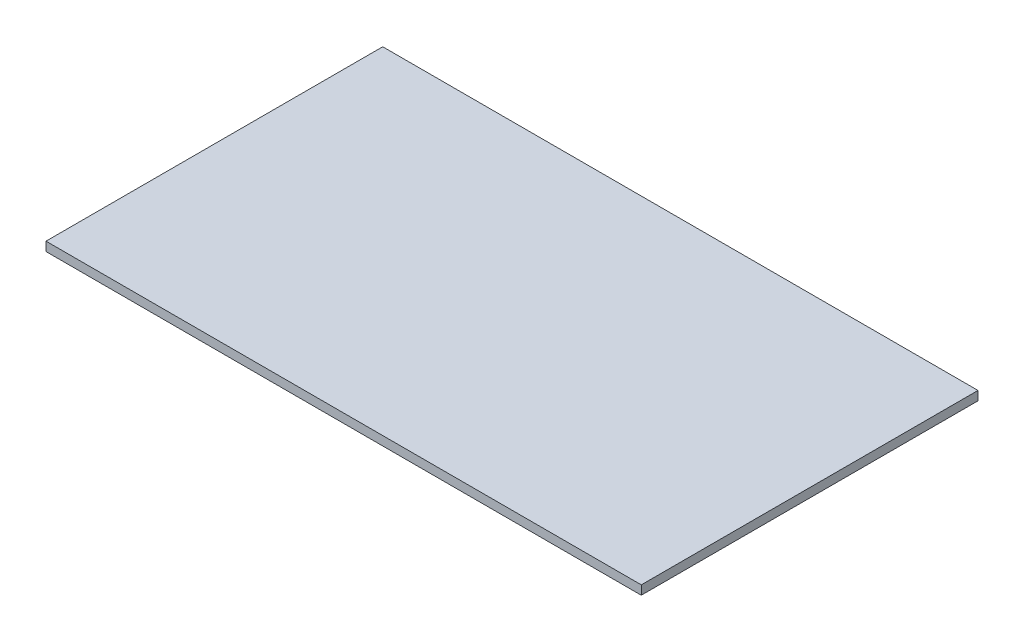
ISO-10303-21;
HEADER;
FILE_DESCRIPTION(('STEP AP214'),'2;1');
FILE_NAME('part.step','',(''),(''),'','','');
FILE_SCHEMA(('AUTOMOTIVE_DESIGN { 1 0 10303 214 1 1 1 1 }'));
ENDSEC;
DATA;
#1=APPLICATION_CONTEXT('core data for automotive mechanical design processes');
#2=APPLICATION_PROTOCOL_DEFINITION('international standard','automotive_design',2000,#1);
#3=PRODUCT_CONTEXT('',#1,'mechanical');
#4=PRODUCT('Part','Part','',(#3));
#5=PRODUCT_RELATED_PRODUCT_CATEGORY('part','',(#4));
#6=PRODUCT_DEFINITION_FORMATION('','',#4);
#7=PRODUCT_DEFINITION_CONTEXT('part definition',#1,'design');
#8=PRODUCT_DEFINITION('design','',#6,#7);
#9=PRODUCT_DEFINITION_SHAPE('','',#8);
#10=(LENGTH_UNIT() NAMED_UNIT(*) SI_UNIT(.MILLI.,.METRE.));
#11=(NAMED_UNIT(*) PLANE_ANGLE_UNIT() SI_UNIT($,.RADIAN.));
#12=(NAMED_UNIT(*) SI_UNIT($,.STERADIAN.) SOLID_ANGLE_UNIT());
#13=UNCERTAINTY_MEASURE_WITH_UNIT(LENGTH_MEASURE(1.E-05),#10,'distance_accuracy_value','');
#14=(GEOMETRIC_REPRESENTATION_CONTEXT(3) GLOBAL_UNCERTAINTY_ASSIGNED_CONTEXT((#13)) GLOBAL_UNIT_ASSIGNED_CONTEXT((#10,
#11,#12)) REPRESENTATION_CONTEXT('',''));
#15=CARTESIAN_POINT('',(0.,0.,0.));
#16=DIRECTION('',(0.,0.,1.));
#17=DIRECTION('',(1.,0.,0.));
#18=AXIS2_PLACEMENT_3D('',#15,#16,#17);
#19=CARTESIAN_POINT('',(0.,0.,112.));
#20=DIRECTION('',(1.,0.,0.));
#21=DIRECTION('',(0.,0.,-1.));
#22=AXIS2_PLACEMENT_3D('',#19,#20,#21);
#23=PLANE('',#22);
#24=DIRECTION('',(0.,-1.,0.));
#25=VECTOR('',#24,1.);
#26=CARTESIAN_POINT('',(0.,0.,0.));
#27=LINE('',#26,#25);
#28=CARTESIAN_POINT('',(0.,3.,0.));
#29=VERTEX_POINT('',#28);
#30=CARTESIAN_POINT('',(0.,0.,0.));
#31=VERTEX_POINT('',#30);
#32=EDGE_CURVE('E108',#29,#31,#27,.T.);
#33=ORIENTED_EDGE('',*,*,#32,.T.);
#34=DIRECTION('',(0.,0.,-1.));
#35=VECTOR('',#34,1.);
#36=CARTESIAN_POINT('',(0.,0.,112.));
#37=LINE('',#36,#35);
#38=CARTESIAN_POINT('',(0.,0.,112.));
#39=VERTEX_POINT('',#38);
#40=EDGE_CURVE('E11',#39,#31,#37,.T.);
#41=ORIENTED_EDGE('',*,*,#40,.F.);
#42=DIRECTION('',(0.,-1.,0.));
#43=VECTOR('',#42,1.);
#44=CARTESIAN_POINT('',(0.,0.,112.));
#45=LINE('',#44,#43);
#46=CARTESIAN_POINT('',(0.,3.,112.));
#47=VERTEX_POINT('',#46);
#48=EDGE_CURVE('E92',#47,#39,#45,.T.);
#49=ORIENTED_EDGE('',*,*,#48,.F.);
#50=DIRECTION('',(0.,0.,-1.));
#51=VECTOR('',#50,1.);
#52=CARTESIAN_POINT('',(0.,3.,112.));
#53=LINE('',#52,#51);
#54=EDGE_CURVE('E105',#47,#29,#53,.T.);
#55=ORIENTED_EDGE('',*,*,#54,.T.);
#56=EDGE_LOOP('',(#33,#41,#49,#55));
#57=FACE_BOUND('',#56,.T.);
#58=ADVANCED_FACE('F43',(#57),#23,.F.);
#59=CARTESIAN_POINT('',(0.,0.,112.));
#60=DIRECTION('',(0.,1.,0.));
#61=DIRECTION('',(0.,0.,1.));
#62=AXIS2_PLACEMENT_3D('',#59,#60,#61);
#63=PLANE('',#62);
#64=DIRECTION('',(1.,0.,0.));
#65=VECTOR('',#64,1.);
#66=CARTESIAN_POINT('',(0.,0.,0.));
#67=LINE('',#66,#65);
#68=CARTESIAN_POINT('',(198.,0.,0.));
#69=VERTEX_POINT('',#68);
#70=EDGE_CURVE('E97',#31,#69,#67,.T.);
#71=ORIENTED_EDGE('',*,*,#70,.T.);
#72=DIRECTION('',(0.,0.,-1.));
#73=VECTOR('',#72,1.);
#74=CARTESIAN_POINT('',(198.,0.,112.));
#75=LINE('',#74,#73);
#76=CARTESIAN_POINT('',(198.,0.,112.));
#77=VERTEX_POINT('',#76);
#78=EDGE_CURVE('E51',#77,#69,#75,.T.);
#79=ORIENTED_EDGE('',*,*,#78,.F.);
#80=DIRECTION('',(1.,0.,0.));
#81=VECTOR('',#80,1.);
#82=CARTESIAN_POINT('',(0.,0.,112.));
#83=LINE('',#82,#81);
#84=EDGE_CURVE('E87',#39,#77,#83,.T.);
#85=ORIENTED_EDGE('',*,*,#84,.F.);
#86=ORIENTED_EDGE('',*,*,#40,.T.);
#87=EDGE_LOOP('',(#71,#79,#85,#86));
#88=FACE_BOUND('',#87,.T.);
#89=ADVANCED_FACE('F100',(#88),#63,.F.);
#90=CARTESIAN_POINT('',(198.,0.,112.));
#91=DIRECTION('',(-1.,0.,0.));
#92=DIRECTION('',(0.,0.,1.));
#93=AXIS2_PLACEMENT_3D('',#90,#91,#92);
#94=PLANE('',#93);
#95=DIRECTION('',(0.,1.,0.));
#96=VECTOR('',#95,1.);
#97=CARTESIAN_POINT('',(198.,0.,0.));
#98=LINE('',#97,#96);
#99=CARTESIAN_POINT('',(198.,3.,0.));
#100=VERTEX_POINT('',#99);
#101=EDGE_CURVE('E78',#69,#100,#98,.T.);
#102=ORIENTED_EDGE('',*,*,#101,.T.);
#103=DIRECTION('',(0.,0.,-1.));
#104=VECTOR('',#103,1.);
#105=CARTESIAN_POINT('',(198.,3.,112.));
#106=LINE('',#105,#104);
#107=CARTESIAN_POINT('',(198.,3.,112.));
#108=VERTEX_POINT('',#107);
#109=EDGE_CURVE('E98',#108,#100,#106,.T.);
#110=ORIENTED_EDGE('',*,*,#109,.F.);
#111=DIRECTION('',(0.,1.,0.));
#112=VECTOR('',#111,1.);
#113=CARTESIAN_POINT('',(198.,0.,112.));
#114=LINE('',#113,#112);
#115=EDGE_CURVE('E95',#77,#108,#114,.T.);
#116=ORIENTED_EDGE('',*,*,#115,.F.);
#117=ORIENTED_EDGE('',*,*,#78,.T.);
#118=EDGE_LOOP('',(#102,#110,#116,#117));
#119=FACE_BOUND('',#118,.T.);
#120=ADVANCED_FACE('F99',(#119),#94,.F.);
#121=CARTESIAN_POINT('',(0.,3.,112.));
#122=DIRECTION('',(0.,-1.,0.));
#123=DIRECTION('',(0.,0.,-1.));
#124=AXIS2_PLACEMENT_3D('',#121,#122,#123);
#125=PLANE('',#124);
#126=DIRECTION('',(-1.,0.,0.));
#127=VECTOR('',#126,1.);
#128=CARTESIAN_POINT('',(0.,3.,0.));
#129=LINE('',#128,#127);
#130=EDGE_CURVE('E85',#100,#29,#129,.T.);
#131=ORIENTED_EDGE('',*,*,#130,.T.);
#132=ORIENTED_EDGE('',*,*,#54,.F.);
#133=DIRECTION('',(-1.,0.,0.));
#134=VECTOR('',#133,1.);
#135=CARTESIAN_POINT('',(0.,3.,112.));
#136=LINE('',#135,#134);
#137=EDGE_CURVE('E56',#108,#47,#136,.T.);
#138=ORIENTED_EDGE('',*,*,#137,.F.);
#139=ORIENTED_EDGE('',*,*,#109,.T.);
#140=EDGE_LOOP('',(#131,#132,#138,#139));
#141=FACE_BOUND('',#140,.T.);
#142=ADVANCED_FACE('F111',(#141),#125,.F.);
#143=CARTESIAN_POINT('',(0.,0.,112.));
#144=DIRECTION('',(0.,0.,-1.));
#145=DIRECTION('',(-1.,0.,0.));
#146=AXIS2_PLACEMENT_3D('',#143,#144,#145);
#147=PLANE('',#146);
#148=ORIENTED_EDGE('',*,*,#48,.T.);
#149=ORIENTED_EDGE('',*,*,#84,.T.);
#150=ORIENTED_EDGE('',*,*,#115,.T.);
#151=ORIENTED_EDGE('',*,*,#137,.T.);
#152=EDGE_LOOP('',(#148,#149,#150,#151));
#153=FACE_BOUND('',#152,.T.);
#154=ADVANCED_FACE('F89',(#153),#147,.F.);
#155=CARTESIAN_POINT('',(0.,0.,0.));
#156=DIRECTION('',(0.,0.,-1.));
#157=DIRECTION('',(-1.,0.,0.));
#158=AXIS2_PLACEMENT_3D('',#155,#156,#157);
#159=PLANE('',#158);
#160=ORIENTED_EDGE('',*,*,#32,.F.);
#161=ORIENTED_EDGE('',*,*,#130,.F.);
#162=ORIENTED_EDGE('',*,*,#101,.F.);
#163=ORIENTED_EDGE('',*,*,#70,.F.);
#164=EDGE_LOOP('',(#160,#161,#162,#163));
#165=FACE_BOUND('',#164,.T.);
#166=ADVANCED_FACE('F118',(#165),#159,.T.);
#167=CLOSED_SHELL('',(#58,#89,#120,#142,#154,#166));
#168=MANIFOLD_SOLID_BREP('B2',#167);
#169=ADVANCED_BREP_SHAPE_REPRESENTATION('',(#18,#168),#14);
#170=SHAPE_DEFINITION_REPRESENTATION(#9,#169);
ENDSEC;
END-ISO-10303-21;
